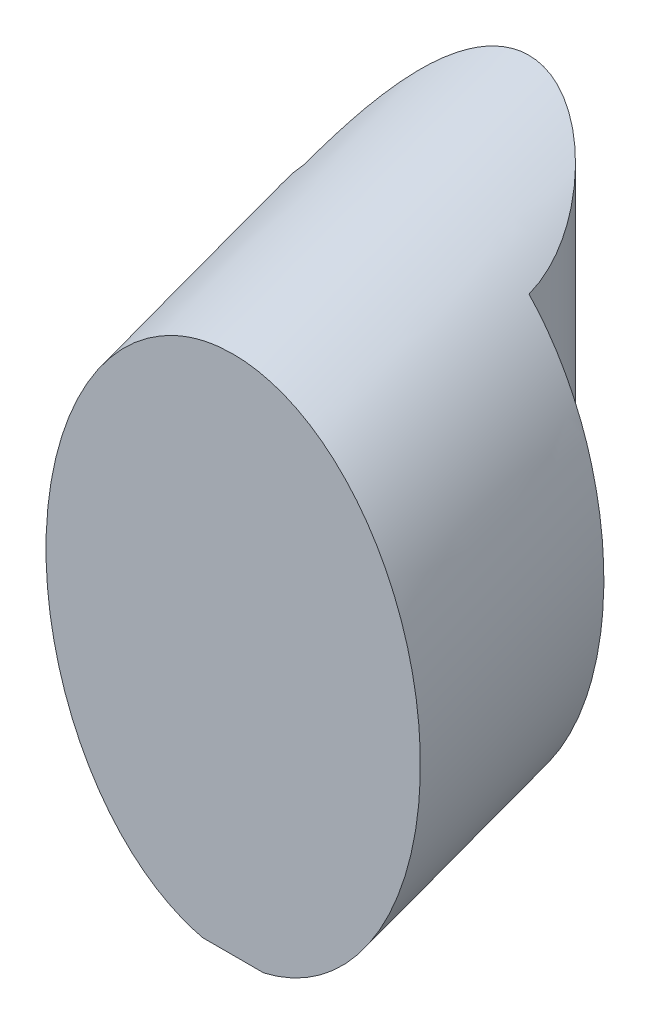
ISO-10303-21;
HEADER;
FILE_DESCRIPTION(('STEP AP214'),'2;1');
FILE_NAME('part.step','',(''),(''),'','','');
FILE_SCHEMA(('AUTOMOTIVE_DESIGN { 1 0 10303 214 1 1 1 1 }'));
ENDSEC;
DATA;
#1=APPLICATION_CONTEXT('core data for automotive mechanical design processes');
#2=APPLICATION_PROTOCOL_DEFINITION('international standard','automotive_design',2000,#1);
#3=PRODUCT_CONTEXT('',#1,'mechanical');
#4=PRODUCT('Part','Part','',(#3));
#5=PRODUCT_RELATED_PRODUCT_CATEGORY('part','',(#4));
#6=PRODUCT_DEFINITION_FORMATION('','',#4);
#7=PRODUCT_DEFINITION_CONTEXT('part definition',#1,'design');
#8=PRODUCT_DEFINITION('design','',#6,#7);
#9=PRODUCT_DEFINITION_SHAPE('','',#8);
#10=(LENGTH_UNIT() NAMED_UNIT(*) SI_UNIT(.MILLI.,.METRE.));
#11=(NAMED_UNIT(*) PLANE_ANGLE_UNIT() SI_UNIT($,.RADIAN.));
#12=(NAMED_UNIT(*) SI_UNIT($,.STERADIAN.) SOLID_ANGLE_UNIT());
#13=UNCERTAINTY_MEASURE_WITH_UNIT(LENGTH_MEASURE(1.E-05),#10,'distance_accuracy_value','');
#14=(GEOMETRIC_REPRESENTATION_CONTEXT(3) GLOBAL_UNCERTAINTY_ASSIGNED_CONTEXT((#13)) GLOBAL_UNIT_ASSIGNED_CONTEXT((#10,
#11,#12)) REPRESENTATION_CONTEXT('',''));
#15=CARTESIAN_POINT('',(0.,0.,0.));
#16=DIRECTION('',(0.,0.,1.));
#17=DIRECTION('',(1.,0.,0.));
#18=AXIS2_PLACEMENT_3D('',#15,#16,#17);
#19=CARTESIAN_POINT('',(-0.0814909660568858,-0.690640337660773,0.));
#20=DIRECTION('',(0.,0.936329177569045,0.351123441588392));
#21=DIRECTION('',(0.,-0.351123441588392,0.936329177569045));
#22=AXIS2_PLACEMENT_3D('',#19,#20,#21);
#23=PLANE('',#22);
#24=DIRECTION('',(-1.,0.,0.));
#25=VECTOR('',#24,1.);
#26=CARTESIAN_POINT('',(-0.0814909660568858,-0.483063466663737,-0.553538322658763));
#27=LINE('',#26,#25);
#28=CARTESIAN_POINT('',(0.0814909660568853,-0.483063466663737,-0.553538322658763));
#29=VERTEX_POINT('',#28);
#30=CARTESIAN_POINT('',(-0.0814909660568858,-0.483063466663737,-0.553538322658763));
#31=VERTEX_POINT('',#30);
#32=EDGE_CURVE('E101',#29,#31,#27,.T.);
#33=ORIENTED_EDGE('',*,*,#32,.F.);
#34=DIRECTION('',(0.,0.351123441588392,-0.936329177569044));
#35=VECTOR('',#34,1.);
#36=CARTESIAN_POINT('',(0.0814909660568855,-0.690640337660773,0.));
#37=LINE('',#36,#35);
#38=CARTESIAN_POINT('',(0.0814909660568855,-0.690640337660773,0.));
#39=VERTEX_POINT('',#38);
#40=EDGE_CURVE('E179',#39,#29,#37,.T.);
#41=ORIENTED_EDGE('',*,*,#40,.F.);
#42=DIRECTION('',(1.,0.,0.));
#43=VECTOR('',#42,1.);
#44=CARTESIAN_POINT('',(-0.0814909660568858,-0.690640337660773,0.));
#45=LINE('',#44,#43);
#46=CARTESIAN_POINT('',(-0.0814909660568858,-0.690640337660773,0.));
#47=VERTEX_POINT('',#46);
#48=EDGE_CURVE('E61',#47,#39,#45,.T.);
#49=ORIENTED_EDGE('',*,*,#48,.F.);
#50=DIRECTION('',(0.,0.351123441588392,-0.936329177569044));
#51=VECTOR('',#50,1.);
#52=CARTESIAN_POINT('',(-0.0814909660568858,-0.690640337660773,0.));
#53=LINE('',#52,#51);
#54=EDGE_CURVE('E151',#47,#31,#53,.T.);
#55=ORIENTED_EDGE('',*,*,#54,.T.);
#56=EDGE_LOOP('',(#33,#41,#49,#55));
#57=FACE_BOUND('',#56,.T.);
#58=ADVANCED_FACE('F39',(#57),#23,.F.);
#59=CARTESIAN_POINT('',(0.0814909660568853,-0.690640337660773,0.));
#60=CARTESIAN_POINT('',(0.0814909660568853,-0.390640337660773,-0.8));
#61=CARTESIAN_POINT('',(0.92661392590139,-0.495191317308179,0.));
#62=CARTESIAN_POINT('',(0.92661392590139,-0.195191317308179,-0.8));
#63=CARTESIAN_POINT('',(0.856576194050407,0.7,0.));
#64=CARTESIAN_POINT('',(0.856576194050407,1.,-0.8));
#65=CARTESIAN_POINT('',(0.,0.7,0.));
#66=CARTESIAN_POINT('',(0.,1.,-0.8));
#67=CARTESIAN_POINT('',(-0.856576194050407,0.7,0.));
#68=CARTESIAN_POINT('',(-0.856576194050407,1.,-0.8));
#69=CARTESIAN_POINT('',(-0.92661392590139,-0.495191317308178,0.));
#70=CARTESIAN_POINT('',(-0.92661392590139,-0.195191317308178,-0.8));
#71=CARTESIAN_POINT('',(-0.0814909660568858,-0.690640337660773,0.));
#72=CARTESIAN_POINT('',(-0.0814909660568858,-0.390640337660773,-0.8));
#73=(BOUNDED_SURFACE() B_SPLINE_SURFACE(3,1,((#59,#60),(#61,#62),(#63,#64),(#65,#66),(#67,#68),
(#69,#70),(#71,#72)),.UNSPECIFIED.,.F.,.F.,.F.) B_SPLINE_SURFACE_WITH_KNOTS((4,3,4),(2,2),(0.,
0.5,1.),(0.,1.),.UNSPECIFIED.) GEOMETRIC_REPRESENTATION_ITEM() RATIONAL_B_SPLINE_SURFACE(((1.,
1.),(0.387843161598816,0.387843161598816),(0.387843161598816,0.387843161598816),(1.,1.),
(0.387843161598816,0.387843161598816),(0.387843161598816,0.387843161598816),(1.,1.))) REPRESENTATION_ITEM('') SURFACE());
#74=CARTESIAN_POINT('',(0.152127431605487,-0.483063466663737,-0.49));
#75=CARTESIAN_POINT('',(0.147004087939198,-0.483063466663765,-0.496104149582116));
#76=CARTESIAN_POINT('',(0.141714585683804,-0.483063466663751,-0.502076267598154));
#77=CARTESIAN_POINT('',(0.130792198634982,-0.483063466663723,-0.513626319649829));
#78=CARTESIAN_POINT('',(0.12516164398018,-0.483063466663709,-0.519206466365634));
#79=CARTESIAN_POINT('',(0.1134802479511,-0.483063466663764,-0.529923565765207));
#80=CARTESIAN_POINT('',(0.107429159579147,-0.483063466663833,-0.535060253947116));
#81=CARTESIAN_POINT('',(0.0948337991181764,-0.48306346666364,-0.544771248817938));
#82=CARTESIAN_POINT('',(0.08828669103775,-0.483063466663377,-0.549341855023253));
#83=CARTESIAN_POINT('',(0.0814909660589838,-0.483063466662739,-0.553538322660131));
#84=B_SPLINE_CURVE_WITH_KNOTS('',3,(#74,#75,#76,#77,#78,#79,#80,#81,#82,#83),.UNSPECIFIED.,.F.,
.F.,(4,2,2,2,4),(0.,0.0239130450950462,0.0476779557088185,0.0714569444141718,
0.0953839804421973),.UNSPECIFIED.);
#85=CARTESIAN_POINT('',(0.152127431605488,-0.483063466663737,-0.49));
#86=VERTEX_POINT('',#85);
#87=EDGE_CURVE('E11',#86,#29,#84,.T.);
#88=CARTESIAN_POINT('',(0.152127431605488,-0.483063466663737,-0.49));
#89=CARTESIAN_POINT('',(0.180348159073946,-0.470448378475534,-0.49));
#90=CARTESIAN_POINT('',(0.206919298272425,-0.454704191996743,-0.49));
#91=CARTESIAN_POINT('',(0.256238816532554,-0.41858189133155,-0.49));
#92=CARTESIAN_POINT('',(0.279030142548352,-0.39826307235944,-0.49));
#93=CARTESIAN_POINT('',(0.322894876852379,-0.352216141783559,-0.49));
#94=CARTESIAN_POINT('',(0.343618516122565,-0.326162689762023,-0.49));
#95=CARTESIAN_POINT('',(0.380994998016609,-0.271154972402938,-0.49));
#96=CARTESIAN_POINT('',(0.397628423691789,-0.242187756905533,-0.49));
#97=CARTESIAN_POINT('',(0.433272410550516,-0.169458505434615,-0.49));
#98=CARTESIAN_POINT('',(0.450229846357061,-0.124690542468183,-0.49));
#99=CARTESIAN_POINT('',(0.476717630369074,-0.0330770236574639,-0.49));
#100=CARTESIAN_POINT('',(0.486246804001412,0.0137688595149103,-0.49));
#101=CARTESIAN_POINT('',(0.498389492936534,0.109264571839093,-0.49));
#102=CARTESIAN_POINT('',(0.500864891718941,0.157931765820299,-0.49));
#103=CARTESIAN_POINT('',(0.498605065948344,0.255144727542134,-0.49));
#104=CARTESIAN_POINT('',(0.493863875502642,0.303690361549969,-0.49));
#105=CARTESIAN_POINT('',(0.477468409981797,0.39663853079842,-0.49));
#106=CARTESIAN_POINT('',(0.466241459932627,0.441115888500398,-0.49));
#107=CARTESIAN_POINT('',(0.436851908752541,0.527606108369783,-0.49));
#108=CARTESIAN_POINT('',(0.418716800372756,0.569627987794065,-0.49));
#109=CARTESIAN_POINT('',(0.383577998651902,0.633807199698442,-0.49));
#110=CARTESIAN_POINT('',(0.368947051476116,0.657264529204577,-0.49));
#111=CARTESIAN_POINT('',(0.33672819822353,0.702185043411284,-0.49));
#112=CARTESIAN_POINT('',(0.319128455039263,0.723639688990051,-0.49));
#113=CARTESIAN_POINT('',(0.3,0.74375,-0.49));
#114=B_SPLINE_CURVE_WITH_KNOTS('',3,(#88,#89,#90,#91,#92,#93,#94,#95,#96,#97,#98,#99,#100,#101,
#102,#103,#104,#105,#106,#107,#108,#109,#110,#111,#112,#113),.UNSPECIFIED.,.F.,.F.,(4,2,2,2,2,2,
2,2,2,2,2,2,4),(0.,0.0922064487006047,0.183280301313779,0.282714674907315,0.382612342956357,
0.525464109011853,0.668338458523106,0.813991754440749,0.959765526109208,1.09688113180325,
1.23345665811436,1.31618716794748,1.39925569256758),.UNSPECIFIED.);
#115=CARTESIAN_POINT('',(0.3,0.74375,-0.49));
#116=VERTEX_POINT('',#115);
#117=EDGE_CURVE('E111',#86,#116,#114,.T.);
#118=CARTESIAN_POINT('',(0.3,0.74375,-0.49));
#119=CARTESIAN_POINT('',(0.299972709297805,0.750277541987975,-0.507418859128777));
#120=CARTESIAN_POINT('',(0.29848732280411,0.758150470182415,-0.524148423937456));
#121=CARTESIAN_POINT('',(0.293088813328304,0.775668755857791,-0.556039572959174));
#122=CARTESIAN_POINT('',(0.289199802070843,0.785295848375361,-0.571215006049882));
#123=CARTESIAN_POINT('',(0.277778675220418,0.809073697162943,-0.605161621412602));
#124=CARTESIAN_POINT('',(0.269451507150554,0.823636864929829,-0.623359354042864));
#125=CARTESIAN_POINT('',(0.249618577719188,0.853340866441697,-0.657582934030292));
#126=CARTESIAN_POINT('',(0.238094811811305,0.868484540664082,-0.673595689104516));
#127=CARTESIAN_POINT('',(0.213981598844629,0.895732634280336,-0.700914614268505));
#128=CARTESIAN_POINT('',(0.201882779419977,0.907925819078934,-0.712561297680661));
#129=CARTESIAN_POINT('',(0.175321298724608,0.931132002430925,-0.734040315779068));
#130=CARTESIAN_POINT('',(0.160868672411587,0.942149696046101,-0.743879991026779));
#131=CARTESIAN_POINT('',(0.1243553812787,0.965172094531407,-0.764015551389072));
#132=CARTESIAN_POINT('',(0.101317919764097,0.976456742018167,-0.773538944941443));
#133=CARTESIAN_POINT('',(0.0659888418454675,0.987606482750571,-0.782853632267643));
#134=CARTESIAN_POINT('',(0.0552128004508222,0.990298933102339,-0.785086008965292));
#135=CARTESIAN_POINT('',(0.0332231130199111,0.994258229432203,-0.788360779064974));
#136=CARTESIAN_POINT('',(0.0220098548206763,0.995526310424175,-0.789404203371573));
#137=CARTESIAN_POINT('',(-0.000565210217756799,0.996507985807857,-0.790212447221029));
#138=CARTESIAN_POINT('',(-0.0119273505468151,0.996217117317667,-0.789973595926775));
#139=CARTESIAN_POINT('',(-0.0344057602088716,0.994107481242702,-0.788234765298448));
#140=CARTESIAN_POINT('',(-0.0455219106528417,0.992287990729051,-0.786734189258544));
#141=CARTESIAN_POINT('',(-0.0772883888653253,0.984953605379344,-0.780649942620154));
#142=CARTESIAN_POINT('',(-0.0972235020355062,0.977576583609283,-0.774497705616696));
#143=CARTESIAN_POINT('',(-0.130499874138167,0.961315928159828,-0.760618776798311));
#144=CARTESIAN_POINT('',(-0.144373299640475,0.95298920696222,-0.753417271452387));
#145=CARTESIAN_POINT('',(-0.170259584079429,0.934992452192471,-0.737470332157023));
#146=CARTESIAN_POINT('',(-0.182268868812694,0.925319903897967,-0.728721999425653));
#147=CARTESIAN_POINT('',(-0.209409223827486,0.900807837678674,-0.705844345024781));
#148=CARTESIAN_POINT('',(-0.223596584221331,0.885564003366914,-0.691038673720148));
#149=CARTESIAN_POINT('',(-0.248647743400676,0.854783982045869,-0.659076572085318));
#150=CARTESIAN_POINT('',(-0.259507663353962,0.839247476081919,-0.641917431753562));
#151=CARTESIAN_POINT('',(-0.275318915427031,0.813211895917875,-0.610097243924926));
#152=CARTESIAN_POINT('',(-0.281073907337926,0.802488120848735,-0.596018244490588));
#153=CARTESIAN_POINT('',(-0.29051425277217,0.782186502776146,-0.566428955789929));
#154=CARTESIAN_POINT('',(-0.294206383278217,0.772604989767458,-0.550923550488977));
#155=CARTESIAN_POINT('',(-0.297730660758338,0.760197987218946,-0.527536413490247));
#156=CARTESIAN_POINT('',(-0.298567322390828,0.756582300705668,-0.520219455843469));
#157=CARTESIAN_POINT('',(-0.299702980268549,0.749802167317445,-0.505306867313924));
#158=CARTESIAN_POINT('',(-0.299999948842714,0.746639463138003,-0.497710294441004));
#159=CARTESIAN_POINT('',(-0.3,0.74375,-0.49));
#160=B_SPLINE_CURVE_WITH_KNOTS('',3,(#118,#119,#120,#121,#122,#123,#124,#125,#126,#127,#128,
#129,#130,#131,#132,#133,#134,#135,#136,#137,#138,#139,#140,#141,#142,#143,#144,#145,#146,#147,
#148,#149,#150,#151,#152,#153,#154,#155,#156,#157,#158,#159),.UNSPECIFIED.,.F.,.F.,(4,2,2,2,2,2,
2,2,2,2,2,2,2,2,2,2,2,2,2,2,4),(0.,0.0554398339477459,0.110332357965706,0.184224344476849,
0.258541280665459,0.320579815354345,0.382360471167865,0.46294295879566,0.496795860363025,
0.530619386716693,0.564539792980904,0.598476250207199,0.663874764668599,0.716781732250828,
0.769788920094569,0.846064352071121,0.922428363770185,0.978110680211996,1.03360897510143,
1.058191132557,1.08286545775145),.UNSPECIFIED.);
#161=CARTESIAN_POINT('',(-0.3,0.74375,-0.49));
#162=VERTEX_POINT('',#161);
#163=EDGE_CURVE('E121',#116,#162,#160,.T.);
#164=CARTESIAN_POINT('',(-0.3,0.74375,-0.49));
#165=CARTESIAN_POINT('',(-0.323027515577957,0.719517161034836,-0.49));
#166=CARTESIAN_POINT('',(-0.343836030529383,0.693373906280778,-0.49));
#167=CARTESIAN_POINT('',(-0.381161841066356,0.638377591798927,-0.49));
#168=CARTESIAN_POINT('',(-0.397702487341185,0.60954050642405,-0.49));
#169=CARTESIAN_POINT('',(-0.433235114196229,0.537029051706983,-0.49));
#170=CARTESIAN_POINT('',(-0.450167312257878,0.492353907930517,-0.49));
#171=CARTESIAN_POINT('',(-0.47668195414429,0.400753267394724,-0.49));
#172=CARTESIAN_POINT('',(-0.486235767664297,0.353819747884446,-0.49));
#173=CARTESIAN_POINT('',(-0.498394631968508,0.258193166476549,-0.49));
#174=CARTESIAN_POINT('',(-0.500868330610085,0.209483617715955,-0.49));
#175=CARTESIAN_POINT('',(-0.49859776123361,0.1122740536412,-0.49));
#176=CARTESIAN_POINT('',(-0.493859800436497,0.0637738923923825,-0.49));
#177=CARTESIAN_POINT('',(-0.477476722283819,-0.0290795209504647,-0.49));
#178=CARTESIAN_POINT('',(-0.466262530119748,-0.073507112270346,-0.49));
#179=CARTESIAN_POINT('',(-0.436914255809968,-0.159969182281848,-0.49));
#180=CARTESIAN_POINT('',(-0.418787894880151,-0.202006271284742,-0.49));
#181=CARTESIAN_POINT('',(-0.370275508049739,-0.29059367408927,-0.49));
#182=CARTESIAN_POINT('',(-0.338115686965914,-0.336241773576142,-0.49));
#183=CARTESIAN_POINT('',(-0.279013624893641,-0.398278401267491,-0.49));
#184=CARTESIAN_POINT('',(-0.256221688358526,-0.41859703648799,-0.49));
#185=CARTESIAN_POINT('',(-0.206911792561717,-0.454707049988131,-0.49));
#186=CARTESIAN_POINT('',(-0.180352617923582,-0.470441513982195,-0.49));
#187=CARTESIAN_POINT('',(-0.152127431608527,-0.483063466662378,-0.49));
#188=B_SPLINE_CURVE_WITH_KNOTS('',3,(#164,#165,#166,#167,#168,#169,#170,#171,#172,#173,#174,
#175,#176,#177,#178,#179,#180,#181,#182,#183,#184,#185,#186,#187),.UNSPECIFIED.,.F.,.F.,(4,2,2,
2,2,2,2,2,2,2,2,4),(0.,0.0999453739010812,0.199331733032951,0.341919587587886,0.485057983188083,
0.630835230107956,0.776485055433745,0.913406819052042,1.05017608057708,1.21562684488611,
1.30672350554787,1.39890717224698),.UNSPECIFIED.);
#189=CARTESIAN_POINT('',(-0.152127431608527,-0.483063466663737,-0.49));
#190=VERTEX_POINT('',#189);
#191=EDGE_CURVE('E115',#162,#190,#188,.T.);
#192=CARTESIAN_POINT('',(-0.0814909660568858,-0.483063466663737,-0.553538322658763));
#193=CARTESIAN_POINT('',(-0.08828669103658,-0.48306346666374,-0.549341855023053));
#194=CARTESIAN_POINT('',(-0.0948337991174471,-0.483063466663738,-0.544771248818195));
#195=CARTESIAN_POINT('',(-0.107429159578832,-0.483063466663735,-0.535060253947664));
#196=CARTESIAN_POINT('',(-0.113480247950762,-0.483063466663734,-0.529923565765594));
#197=CARTESIAN_POINT('',(-0.125161643979869,-0.48306346666374,-0.519206466365844));
#198=CARTESIAN_POINT('',(-0.130792198634721,-0.483063466663748,-0.513626319650024));
#199=CARTESIAN_POINT('',(-0.141714585683708,-0.483063466663726,-0.502076267598338));
#200=CARTESIAN_POINT('',(-0.147004087939215,-0.483063466663695,-0.496104149582301));
#201=CARTESIAN_POINT('',(-0.152127431605615,-0.483063466663622,-0.490000000000156));
#202=B_SPLINE_CURVE_WITH_KNOTS('',3,(#192,#193,#194,#195,#196,#197,#198,#199,#200,#201),
.UNSPECIFIED.,.F.,.F.,(4,2,2,2,4),(0.,0.0239270360283258,0.047706024733893,0.0714709353478217,
0.0953839804431108),.UNSPECIFIED.);
#203=EDGE_CURVE('E54',#31,#190,#202,.T.);
#204=CARTESIAN_POINT('',(0.,0.,0.));
#205=DIRECTION('',(0.,0.,1.));
#206=DIRECTION('',(0.,1.,0.));
#207=AXIS2_PLACEMENT_3D('',#204,#205,#206);
#208=ELLIPSE('',#207,0.7,0.5);
#209=EDGE_CURVE('E68',#39,#47,#208,.T.);
#210=ORIENTED_EDGE('',*,*,#87,.F.);
#211=ORIENTED_EDGE('',*,*,#117,.T.);
#212=ORIENTED_EDGE('',*,*,#163,.T.);
#213=ORIENTED_EDGE('',*,*,#191,.T.);
#214=ORIENTED_EDGE('',*,*,#203,.F.);
#215=ORIENTED_EDGE('',*,*,#54,.F.);
#216=ORIENTED_EDGE('',*,*,#209,.F.);
#217=ORIENTED_EDGE('',*,*,#40,.T.);
#218=EDGE_LOOP('',(#210,#211,#212,#213,#214,#215,#216,#217));
#219=FACE_BOUND('',#218,.T.);
#220=ADVANCED_FACE('F133',(#219),#73,.F.);
#221=CARTESIAN_POINT('',(0.,-0.690640337660773,-0.49));
#222=DIRECTION('',(0.,1.,0.));
#223=DIRECTION('',(0.,0.,1.));
#224=AXIS2_PLACEMENT_3D('',#221,#222,#223);
#225=CYLINDRICAL_SURFACE('',#224,0.3);
#226=DIRECTION('',(0.,1.,0.));
#227=VECTOR('',#226,1.);
#228=CARTESIAN_POINT('',(0.3,-0.690640337660773,-0.49));
#229=LINE('',#228,#227);
#230=CARTESIAN_POINT('',(0.3,-0.33625,-0.49));
#231=VERTEX_POINT('',#230);
#232=EDGE_CURVE('E109',#231,#116,#229,.T.);
#233=ORIENTED_EDGE('',*,*,#232,.F.);
#234=CARTESIAN_POINT('',(0.,-0.33625,-0.49));
#235=DIRECTION('',(0.,-1.,0.));
#236=DIRECTION('',(0.,0.,-1.));
#237=AXIS2_PLACEMENT_3D('',#234,#235,#236);
#238=CIRCLE('',#237,0.3);
#239=CARTESIAN_POINT('',(-0.3,-0.33625,-0.49));
#240=VERTEX_POINT('',#239);
#241=EDGE_CURVE('E96',#240,#231,#238,.T.);
#242=ORIENTED_EDGE('',*,*,#241,.F.);
#243=DIRECTION('',(0.,1.,0.));
#244=VECTOR('',#243,1.);
#245=CARTESIAN_POINT('',(-0.3,-0.690640337660773,-0.49));
#246=LINE('',#245,#244);
#247=EDGE_CURVE('E107',#240,#162,#246,.T.);
#248=ORIENTED_EDGE('',*,*,#247,.T.);
#249=ORIENTED_EDGE('',*,*,#163,.F.);
#250=EDGE_LOOP('',(#233,#242,#248,#249));
#251=FACE_BOUND('',#250,.T.);
#252=ADVANCED_FACE('F105',(#251),#225,.T.);
#253=CARTESIAN_POINT('',(0.,0.,0.));
#254=DIRECTION('',(0.,0.,1.));
#255=DIRECTION('',(1.,0.,0.));
#256=AXIS2_PLACEMENT_3D('',#253,#254,#255);
#257=PLANE('',#256);
#258=ORIENTED_EDGE('',*,*,#209,.T.);
#259=ORIENTED_EDGE('',*,*,#48,.T.);
#260=EDGE_LOOP('',(#258,#259));
#261=FACE_BOUND('',#260,.T.);
#262=ADVANCED_FACE('F41',(#261),#257,.T.);
#263=CARTESIAN_POINT('',(0.3,-0.690640337660773,-0.49));
#264=DIRECTION('',(0.,0.,1.));
#265=DIRECTION('',(1.,0.,0.));
#266=AXIS2_PLACEMENT_3D('',#263,#264,#265);
#267=PLANE('',#266);
#268=ORIENTED_EDGE('',*,*,#117,.F.);
#269=DIRECTION('',(-1.,0.,0.));
#270=VECTOR('',#269,1.);
#271=CARTESIAN_POINT('',(0.3,-0.483063466663737,-0.49));
#272=LINE('',#271,#270);
#273=EDGE_CURVE('E102',#86,#190,#272,.T.);
#274=ORIENTED_EDGE('',*,*,#273,.T.);
#275=ORIENTED_EDGE('',*,*,#191,.F.);
#276=ORIENTED_EDGE('',*,*,#247,.F.);
#277=DIRECTION('',(1.,0.,0.));
#278=VECTOR('',#277,1.);
#279=CARTESIAN_POINT('',(0.3,-0.33625,-0.49));
#280=LINE('',#279,#278);
#281=EDGE_CURVE('E93',#240,#231,#280,.T.);
#282=ORIENTED_EDGE('',*,*,#281,.T.);
#283=ORIENTED_EDGE('',*,*,#232,.T.);
#284=EDGE_LOOP('',(#268,#274,#275,#276,#282,#283));
#285=FACE_BOUND('',#284,.T.);
#286=ADVANCED_FACE('F113',(#285),#267,.F.);
#287=CARTESIAN_POINT('',(0.3,-0.483063466663737,-0.79));
#288=DIRECTION('',(0.,1.,0.));
#289=DIRECTION('',(0.,0.,1.));
#290=AXIS2_PLACEMENT_3D('',#287,#288,#289);
#291=PLANE('',#290);
#292=ORIENTED_EDGE('',*,*,#203,.T.);
#293=ORIENTED_EDGE('',*,*,#273,.F.);
#294=ORIENTED_EDGE('',*,*,#87,.T.);
#295=ORIENTED_EDGE('',*,*,#32,.T.);
#296=EDGE_LOOP('',(#292,#293,#294,#295));
#297=FACE_BOUND('',#296,.T.);
#298=ADVANCED_FACE('F165',(#297),#291,.T.);
#299=CARTESIAN_POINT('',(0.3,-0.33625,-0.79));
#300=DIRECTION('',(0.,-1.,0.));
#301=DIRECTION('',(0.,0.,-1.));
#302=AXIS2_PLACEMENT_3D('',#299,#300,#301);
#303=PLANE('',#302);
#304=ORIENTED_EDGE('',*,*,#241,.T.);
#305=ORIENTED_EDGE('',*,*,#281,.F.);
#306=EDGE_LOOP('',(#304,#305));
#307=FACE_BOUND('',#306,.T.);
#308=ADVANCED_FACE('F95',(#307),#303,.T.);
#309=CLOSED_SHELL('',(#58,#220,#252,#262,#286,#298,#308));
#310=MANIFOLD_SOLID_BREP('B2',#309);
#311=ADVANCED_BREP_SHAPE_REPRESENTATION('',(#18,#310),#14);
#312=SHAPE_DEFINITION_REPRESENTATION(#9,#311);
ENDSEC;
END-ISO-10303-21;
